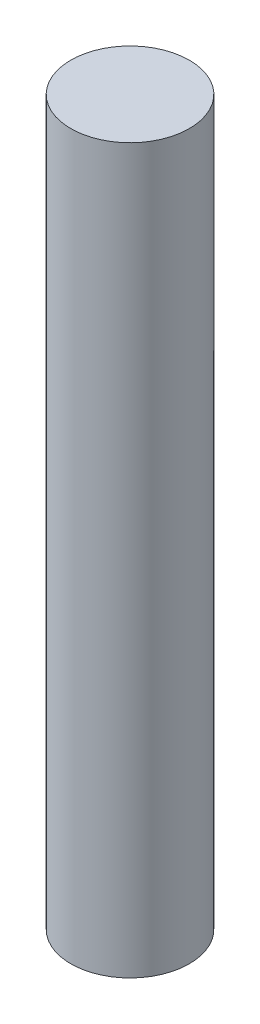
ISO-10303-21;
HEADER;
FILE_DESCRIPTION(('STEP AP214'),'2;1');
FILE_NAME('part.step','',(''),(''),'','','');
FILE_SCHEMA(('AUTOMOTIVE_DESIGN { 1 0 10303 214 1 1 1 1 }'));
ENDSEC;
DATA;
#1=APPLICATION_CONTEXT('core data for automotive mechanical design processes');
#2=APPLICATION_PROTOCOL_DEFINITION('international standard','automotive_design',2000,#1);
#3=PRODUCT_CONTEXT('',#1,'mechanical');
#4=PRODUCT('Part','Part','',(#3));
#5=PRODUCT_RELATED_PRODUCT_CATEGORY('part','',(#4));
#6=PRODUCT_DEFINITION_FORMATION('','',#4);
#7=PRODUCT_DEFINITION_CONTEXT('part definition',#1,'design');
#8=PRODUCT_DEFINITION('design','',#6,#7);
#9=PRODUCT_DEFINITION_SHAPE('','',#8);
#10=(LENGTH_UNIT() NAMED_UNIT(*) SI_UNIT(.MILLI.,.METRE.));
#11=(NAMED_UNIT(*) PLANE_ANGLE_UNIT() SI_UNIT($,.RADIAN.));
#12=(NAMED_UNIT(*) SI_UNIT($,.STERADIAN.) SOLID_ANGLE_UNIT());
#13=UNCERTAINTY_MEASURE_WITH_UNIT(LENGTH_MEASURE(1.E-05),#10,'distance_accuracy_value','');
#14=(GEOMETRIC_REPRESENTATION_CONTEXT(3) GLOBAL_UNCERTAINTY_ASSIGNED_CONTEXT((#13)) GLOBAL_UNIT_ASSIGNED_CONTEXT((#10,
#11,#12)) REPRESENTATION_CONTEXT('',''));
#15=CARTESIAN_POINT('',(0.,0.,0.));
#16=DIRECTION('',(0.,0.,1.));
#17=DIRECTION('',(1.,0.,0.));
#18=AXIS2_PLACEMENT_3D('',#15,#16,#17);
#19=CARTESIAN_POINT('',(0.,61.,0.));
#20=DIRECTION('',(0.,-1.,0.));
#21=DIRECTION('',(0.,0.,-1.));
#22=AXIS2_PLACEMENT_3D('',#19,#20,#21);
#23=CYLINDRICAL_SURFACE('',#22,10.);
#24=CARTESIAN_POINT('',(0.,61.,0.));
#25=DIRECTION('',(0.,1.,0.));
#26=DIRECTION('',(0.,0.,1.));
#27=AXIS2_PLACEMENT_3D('',#24,#25,#26);
#28=CIRCLE('',#27,10.);
#29=CARTESIAN_POINT('',(0.,61.,-10.));
#30=VERTEX_POINT('',#29);
#31=EDGE_CURVE('E10',#30,#30,#28,.T.);
#32=CARTESIAN_POINT('',(0.,-61.,0.));
#33=DIRECTION('',(0.,1.,0.));
#34=DIRECTION('',(0.,0.,1.));
#35=AXIS2_PLACEMENT_3D('',#32,#33,#34);
#36=CIRCLE('',#35,10.);
#37=CARTESIAN_POINT('',(0.,-61.,-10.));
#38=VERTEX_POINT('',#37);
#39=EDGE_CURVE('E37',#38,#38,#36,.T.);
#40=CARTESIAN_POINT('',(0.,61.,-10.));
#41=CARTESIAN_POINT('',(0.,59.7291666666667,-10.));
#42=CARTESIAN_POINT('',(0.,58.4583333333333,-10.));
#43=CARTESIAN_POINT('',(0.,55.9166666666667,-10.));
#44=CARTESIAN_POINT('',(0.,54.6458333333333,-10.));
#45=CARTESIAN_POINT('',(0.,52.1041666666667,-10.));
#46=CARTESIAN_POINT('',(0.,50.8333333333333,-10.));
#47=CARTESIAN_POINT('',(0.,48.2916666666667,-10.));
#48=CARTESIAN_POINT('',(0.,47.0208333333333,-10.));
#49=CARTESIAN_POINT('',(0.,44.4791666666667,-10.));
#50=CARTESIAN_POINT('',(0.,43.2083333333333,-10.));
#51=CARTESIAN_POINT('',(0.,40.6666666666667,-10.));
#52=CARTESIAN_POINT('',(0.,39.3958333333333,-10.));
#53=CARTESIAN_POINT('',(0.,36.8541666666667,-10.));
#54=CARTESIAN_POINT('',(0.,35.5833333333333,-10.));
#55=CARTESIAN_POINT('',(0.,33.0416666666667,-10.));
#56=CARTESIAN_POINT('',(0.,31.7708333333333,-10.));
#57=CARTESIAN_POINT('',(0.,29.2291666666667,-10.));
#58=CARTESIAN_POINT('',(0.,27.9583333333333,-10.));
#59=CARTESIAN_POINT('',(0.,25.4166666666667,-10.));
#60=CARTESIAN_POINT('',(0.,24.1458333333333,-10.));
#61=CARTESIAN_POINT('',(0.,21.6041666666667,-10.));
#62=CARTESIAN_POINT('',(0.,20.3333333333333,-10.));
#63=CARTESIAN_POINT('',(0.,17.7916666666667,-10.));
#64=CARTESIAN_POINT('',(0.,16.5208333333333,-10.));
#65=CARTESIAN_POINT('',(0.,13.9791666666667,-10.));
#66=CARTESIAN_POINT('',(0.,12.7083333333333,-10.));
#67=CARTESIAN_POINT('',(0.,10.1666666666667,-10.));
#68=CARTESIAN_POINT('',(0.,8.89583333333332,-10.));
#69=CARTESIAN_POINT('',(0.,6.35416666666665,-10.));
#70=CARTESIAN_POINT('',(0.,5.08333333333332,-10.));
#71=CARTESIAN_POINT('',(0.,2.54166666666665,-10.));
#72=CARTESIAN_POINT('',(0.,1.27083333333332,-10.));
#73=CARTESIAN_POINT('',(0.,-1.27083333333334,-10.));
#74=CARTESIAN_POINT('',(0.,-2.54166666666667,-10.));
#75=CARTESIAN_POINT('',(0.,-5.08333333333333,-10.));
#76=CARTESIAN_POINT('',(0.,-6.35416666666667,-10.));
#77=CARTESIAN_POINT('',(0.,-8.89583333333334,-10.));
#78=CARTESIAN_POINT('',(0.,-10.1666666666667,-10.));
#79=CARTESIAN_POINT('',(0.,-12.7083333333333,-10.));
#80=CARTESIAN_POINT('',(0.,-13.9791666666667,-10.));
#81=CARTESIAN_POINT('',(0.,-16.5208333333333,-10.));
#82=CARTESIAN_POINT('',(0.,-17.7916666666667,-10.));
#83=CARTESIAN_POINT('',(0.,-20.3333333333333,-10.));
#84=CARTESIAN_POINT('',(0.,-21.6041666666667,-10.));
#85=CARTESIAN_POINT('',(0.,-24.1458333333333,-10.));
#86=CARTESIAN_POINT('',(0.,-25.4166666666667,-10.));
#87=CARTESIAN_POINT('',(0.,-27.9583333333333,-10.));
#88=CARTESIAN_POINT('',(0.,-29.2291666666667,-10.));
#89=CARTESIAN_POINT('',(0.,-31.7708333333333,-10.));
#90=CARTESIAN_POINT('',(0.,-33.0416666666667,-10.));
#91=CARTESIAN_POINT('',(0.,-35.5833333333333,-10.));
#92=CARTESIAN_POINT('',(0.,-36.8541666666667,-10.));
#93=CARTESIAN_POINT('',(0.,-39.3958333333333,-10.));
#94=CARTESIAN_POINT('',(0.,-40.6666666666667,-10.));
#95=CARTESIAN_POINT('',(0.,-43.2083333333333,-10.));
#96=CARTESIAN_POINT('',(0.,-44.4791666666667,-10.));
#97=CARTESIAN_POINT('',(0.,-47.0208333333333,-10.));
#98=CARTESIAN_POINT('',(0.,-48.2916666666667,-10.));
#99=CARTESIAN_POINT('',(0.,-50.8333333333333,-10.));
#100=CARTESIAN_POINT('',(0.,-52.1041666666667,-10.));
#101=CARTESIAN_POINT('',(0.,-54.6458333333333,-10.));
#102=CARTESIAN_POINT('',(0.,-55.9166666666667,-10.));
#103=CARTESIAN_POINT('',(0.,-58.4583333333333,-10.));
#104=CARTESIAN_POINT('',(0.,-59.7291666666667,-10.));
#105=CARTESIAN_POINT('',(0.,-61.,-10.));
#106=B_SPLINE_CURVE_WITH_KNOTS('',3,(#40,#41,#42,#43,#44,#45,#46,#47,#48,#49,#50,#51,#52,#53,
#54,#55,#56,#57,#58,#59,#60,#61,#62,#63,#64,#65,#66,#67,#68,#69,#70,#71,#72,#73,#74,#75,#76,#77,
#78,#79,#80,#81,#82,#83,#84,#85,#86,#87,#88,#89,#90,#91,#92,#93,#94,#95,#96,#97,#98,#99,#100,
#101,#102,#103,#104,#105),.UNSPECIFIED.,.F.,.F.,(4,2,2,2,2,2,2,2,2,2,2,2,2,2,2,2,2,2,2,2,2,2,2,
2,2,2,2,2,2,2,2,2,4),(0.,3.8125,7.625,11.4375,15.25,19.0625,22.875,26.6875,30.5,34.3125,38.125,
41.9375,45.75,49.5625,53.375,57.1875,61.,64.8125,68.625,72.4375,76.25,80.0625,83.875,87.6875,
91.5,95.3125,99.125,102.9375,106.75,110.5625,114.375,118.1875,122.),.UNSPECIFIED.);
#107=EDGE_CURVE('BSEAM34',#30,#38,#106,.T.);
#108=ORIENTED_EDGE('',*,*,#31,.F.);
#109=ORIENTED_EDGE('',*,*,#39,.T.);
#110=ORIENTED_EDGE('',*,*,#107,.T.);
#111=ORIENTED_EDGE('',*,*,#107,.F.);
#112=EDGE_LOOP('',(#108,#110,#109,#111));
#113=FACE_BOUND('',#112,.T.);
#114=ADVANCED_FACE('F34',(#113),#23,.T.);
#115=CARTESIAN_POINT('',(0.,61.,0.));
#116=DIRECTION('',(0.,1.,0.));
#117=DIRECTION('',(0.,0.,1.));
#118=AXIS2_PLACEMENT_3D('',#115,#116,#117);
#119=PLANE('',#118);
#120=ORIENTED_EDGE('',*,*,#31,.T.);
#121=EDGE_LOOP('',(#120));
#122=FACE_BOUND('',#121,.T.);
#123=ADVANCED_FACE('F49',(#122),#119,.T.);
#124=CARTESIAN_POINT('',(0.,-61.,0.));
#125=DIRECTION('',(0.,1.,0.));
#126=DIRECTION('',(0.,0.,1.));
#127=AXIS2_PLACEMENT_3D('',#124,#125,#126);
#128=PLANE('',#127);
#129=ORIENTED_EDGE('',*,*,#39,.F.);
#130=EDGE_LOOP('',(#129));
#131=FACE_BOUND('',#130,.T.);
#132=ADVANCED_FACE('F47',(#131),#128,.F.);
#133=CLOSED_SHELL('',(#114,#123,#132));
#134=MANIFOLD_SOLID_BREP('B2',#133);
#135=ADVANCED_BREP_SHAPE_REPRESENTATION('',(#18,#134),#14);
#136=SHAPE_DEFINITION_REPRESENTATION(#9,#135);
ENDSEC;
END-ISO-10303-21;
